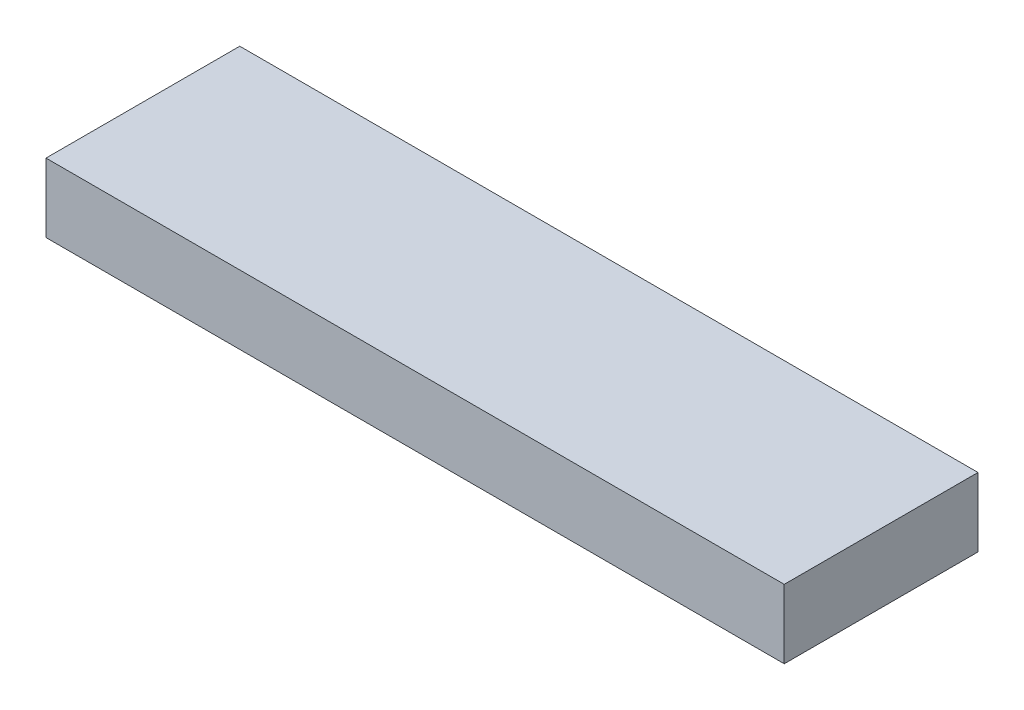
ISO-10303-21;
HEADER;
FILE_DESCRIPTION(('STEP AP214'),'2;1');
FILE_NAME('part.step','',(''),(''),'','','');
FILE_SCHEMA(('AUTOMOTIVE_DESIGN { 1 0 10303 214 1 1 1 1 }'));
ENDSEC;
DATA;
#1=APPLICATION_CONTEXT('core data for automotive mechanical design processes');
#2=APPLICATION_PROTOCOL_DEFINITION('international standard','automotive_design',2000,#1);
#3=PRODUCT_CONTEXT('',#1,'mechanical');
#4=PRODUCT('Part','Part','',(#3));
#5=PRODUCT_RELATED_PRODUCT_CATEGORY('part','',(#4));
#6=PRODUCT_DEFINITION_FORMATION('','',#4);
#7=PRODUCT_DEFINITION_CONTEXT('part definition',#1,'design');
#8=PRODUCT_DEFINITION('design','',#6,#7);
#9=PRODUCT_DEFINITION_SHAPE('','',#8);
#10=(LENGTH_UNIT() NAMED_UNIT(*) SI_UNIT(.MILLI.,.METRE.));
#11=(NAMED_UNIT(*) PLANE_ANGLE_UNIT() SI_UNIT($,.RADIAN.));
#12=(NAMED_UNIT(*) SI_UNIT($,.STERADIAN.) SOLID_ANGLE_UNIT());
#13=UNCERTAINTY_MEASURE_WITH_UNIT(LENGTH_MEASURE(1.E-05),#10,'distance_accuracy_value','');
#14=(GEOMETRIC_REPRESENTATION_CONTEXT(3) GLOBAL_UNCERTAINTY_ASSIGNED_CONTEXT((#13)) GLOBAL_UNIT_ASSIGNED_CONTEXT((#10,
#11,#12)) REPRESENTATION_CONTEXT('',''));
#15=CARTESIAN_POINT('',(0.,0.,0.));
#16=DIRECTION('',(0.,0.,1.));
#17=DIRECTION('',(1.,0.,0.));
#18=AXIS2_PLACEMENT_3D('',#15,#16,#17);
#19=CARTESIAN_POINT('',(4.7625,-0.44425616,0.));
#20=DIRECTION('',(-1.,0.,0.));
#21=DIRECTION('',(0.,0.,1.));
#22=AXIS2_PLACEMENT_3D('',#19,#20,#21);
#23=PLANE('',#22);
#24=DIRECTION('',(0.,1.,0.));
#25=VECTOR('',#24,1.);
#26=CARTESIAN_POINT('',(4.7625,-0.44425616,0.));
#27=LINE('',#26,#25);
#28=CARTESIAN_POINT('',(4.7625,-0.44425616,0.));
#29=VERTEX_POINT('',#28);
#30=CARTESIAN_POINT('',(4.7625,0.44373546,0.));
#31=VERTEX_POINT('',#30);
#32=EDGE_CURVE('E11',#29,#31,#27,.T.);
#33=ORIENTED_EDGE('',*,*,#32,.T.);
#34=DIRECTION('',(0.,0.,1.));
#35=VECTOR('',#34,1.);
#36=CARTESIAN_POINT('',(4.7625,0.44373546,0.));
#37=LINE('',#36,#35);
#38=CARTESIAN_POINT('',(4.7625,0.44373546,2.50000008));
#39=VERTEX_POINT('',#38);
#40=EDGE_CURVE('E27',#31,#39,#37,.T.);
#41=ORIENTED_EDGE('',*,*,#40,.T.);
#42=DIRECTION('',(0.,1.,0.));
#43=VECTOR('',#42,1.);
#44=CARTESIAN_POINT('',(4.7625,-0.44425616,2.50000008));
#45=LINE('',#44,#43);
#46=CARTESIAN_POINT('',(4.7625,-0.44425616,2.50000008));
#47=VERTEX_POINT('',#46);
#48=EDGE_CURVE('E51',#47,#39,#45,.T.);
#49=ORIENTED_EDGE('',*,*,#48,.F.);
#50=DIRECTION('',(0.,0.,1.));
#51=VECTOR('',#50,1.);
#52=CARTESIAN_POINT('',(4.7625,-0.44425616,0.));
#53=LINE('',#52,#51);
#54=EDGE_CURVE('E99',#29,#47,#53,.T.);
#55=ORIENTED_EDGE('',*,*,#54,.F.);
#56=EDGE_LOOP('',(#33,#41,#49,#55));
#57=FACE_BOUND('',#56,.T.);
#58=ADVANCED_FACE('F17',(#57),#23,.F.);
#59=CARTESIAN_POINT('',(4.7625,0.44373546,0.));
#60=DIRECTION('',(-5.46666665830079E-05,-0.999999998505778,0.));
#61=DIRECTION('',(-0.999999998505778,5.46666665830079E-05,0.));
#62=AXIS2_PLACEMENT_3D('',#59,#60,#61);
#63=PLANE('',#62);
#64=DIRECTION('',(-0.999999998505778,5.46666665830079E-05,0.));
#65=VECTOR('',#64,1.);
#66=CARTESIAN_POINT('',(4.7625,0.44373546,0.));
#67=LINE('',#66,#65);
#68=CARTESIAN_POINT('',(-4.7625,0.44425616,0.));
#69=VERTEX_POINT('',#68);
#70=EDGE_CURVE('E76',#31,#69,#67,.T.);
#71=ORIENTED_EDGE('',*,*,#70,.T.);
#72=DIRECTION('',(0.,0.,1.));
#73=VECTOR('',#72,1.);
#74=CARTESIAN_POINT('',(-4.7625,0.44425616,0.));
#75=LINE('',#74,#73);
#76=CARTESIAN_POINT('',(-4.7625,0.44425616,2.50000008));
#77=VERTEX_POINT('',#76);
#78=EDGE_CURVE('E73',#69,#77,#75,.T.);
#79=ORIENTED_EDGE('',*,*,#78,.T.);
#80=DIRECTION('',(-0.999999998505778,5.46666665830079E-05,0.));
#81=VECTOR('',#80,1.);
#82=CARTESIAN_POINT('',(4.7625,0.44373546,2.50000008));
#83=LINE('',#82,#81);
#84=EDGE_CURVE('E21',#39,#77,#83,.T.);
#85=ORIENTED_EDGE('',*,*,#84,.F.);
#86=ORIENTED_EDGE('',*,*,#40,.F.);
#87=EDGE_LOOP('',(#71,#79,#85,#86));
#88=FACE_BOUND('',#87,.T.);
#89=ADVANCED_FACE('F74',(#88),#63,.F.);
#90=CARTESIAN_POINT('',(-4.7625,0.44425616,0.));
#91=DIRECTION('',(1.,0.,0.));
#92=DIRECTION('',(0.,1.,0.));
#93=AXIS2_PLACEMENT_3D('',#90,#91,#92);
#94=PLANE('',#93);
#95=DIRECTION('',(0.,-1.,0.));
#96=VECTOR('',#95,1.);
#97=CARTESIAN_POINT('',(-4.7625,0.44425616,0.));
#98=LINE('',#97,#96);
#99=CARTESIAN_POINT('',(-4.7625,-0.44425616,0.));
#100=VERTEX_POINT('',#99);
#101=EDGE_CURVE('E81',#69,#100,#98,.T.);
#102=ORIENTED_EDGE('',*,*,#101,.T.);
#103=DIRECTION('',(0.,0.,1.));
#104=VECTOR('',#103,1.);
#105=CARTESIAN_POINT('',(-4.7625,-0.44425616,0.));
#106=LINE('',#105,#104);
#107=CARTESIAN_POINT('',(-4.7625,-0.44425616,2.50000008));
#108=VERTEX_POINT('',#107);
#109=EDGE_CURVE('E84',#100,#108,#106,.T.);
#110=ORIENTED_EDGE('',*,*,#109,.T.);
#111=DIRECTION('',(0.,-1.,0.));
#112=VECTOR('',#111,1.);
#113=CARTESIAN_POINT('',(-4.7625,0.44425616,2.50000008));
#114=LINE('',#113,#112);
#115=EDGE_CURVE('E70',#77,#108,#114,.T.);
#116=ORIENTED_EDGE('',*,*,#115,.F.);
#117=ORIENTED_EDGE('',*,*,#78,.F.);
#118=EDGE_LOOP('',(#102,#110,#116,#117));
#119=FACE_BOUND('',#118,.T.);
#120=ADVANCED_FACE('F83',(#119),#94,.F.);
#121=CARTESIAN_POINT('',(-4.7625,-0.44425616,0.));
#122=DIRECTION('',(0.,1.,0.));
#123=DIRECTION('',(1.,0.,0.));
#124=AXIS2_PLACEMENT_3D('',#121,#122,#123);
#125=PLANE('',#124);
#126=DIRECTION('',(1.,0.,0.));
#127=VECTOR('',#126,1.);
#128=CARTESIAN_POINT('',(-4.7625,-0.44425616,0.));
#129=LINE('',#128,#127);
#130=EDGE_CURVE('E95',#100,#29,#129,.T.);
#131=ORIENTED_EDGE('',*,*,#130,.T.);
#132=ORIENTED_EDGE('',*,*,#54,.T.);
#133=DIRECTION('',(1.,0.,0.));
#134=VECTOR('',#133,1.);
#135=CARTESIAN_POINT('',(-4.7625,-0.44425616,2.50000008));
#136=LINE('',#135,#134);
#137=EDGE_CURVE('E87',#108,#47,#136,.T.);
#138=ORIENTED_EDGE('',*,*,#137,.F.);
#139=ORIENTED_EDGE('',*,*,#109,.F.);
#140=EDGE_LOOP('',(#131,#132,#138,#139));
#141=FACE_BOUND('',#140,.T.);
#142=ADVANCED_FACE('F129',(#141),#125,.F.);
#143=CARTESIAN_POINT('',(4.7625,-0.44425616,0.));
#144=DIRECTION('',(0.,0.,-1.));
#145=DIRECTION('',(0.,-1.,0.));
#146=AXIS2_PLACEMENT_3D('',#143,#144,#145);
#147=PLANE('',#146);
#148=ORIENTED_EDGE('',*,*,#130,.F.);
#149=ORIENTED_EDGE('',*,*,#101,.F.);
#150=ORIENTED_EDGE('',*,*,#70,.F.);
#151=ORIENTED_EDGE('',*,*,#32,.F.);
#152=EDGE_LOOP('',(#148,#149,#150,#151));
#153=FACE_BOUND('',#152,.T.);
#154=ADVANCED_FACE('F127',(#153),#147,.T.);
#155=CARTESIAN_POINT('',(4.7625,-0.44425616,2.50000008));
#156=DIRECTION('',(0.,0.,-1.));
#157=DIRECTION('',(0.,-1.,0.));
#158=AXIS2_PLACEMENT_3D('',#155,#156,#157);
#159=PLANE('',#158);
#160=ORIENTED_EDGE('',*,*,#48,.T.);
#161=ORIENTED_EDGE('',*,*,#84,.T.);
#162=ORIENTED_EDGE('',*,*,#115,.T.);
#163=ORIENTED_EDGE('',*,*,#137,.T.);
#164=EDGE_LOOP('',(#160,#161,#162,#163));
#165=FACE_BOUND('',#164,.T.);
#166=ADVANCED_FACE('F19',(#165),#159,.F.);
#167=CLOSED_SHELL('',(#58,#89,#120,#142,#154,#166));
#168=MANIFOLD_SOLID_BREP('B1',#167);
#169=ADVANCED_BREP_SHAPE_REPRESENTATION('',(#18,#168),#14);
#170=SHAPE_DEFINITION_REPRESENTATION(#9,#169);
ENDSEC;
END-ISO-10303-21;
